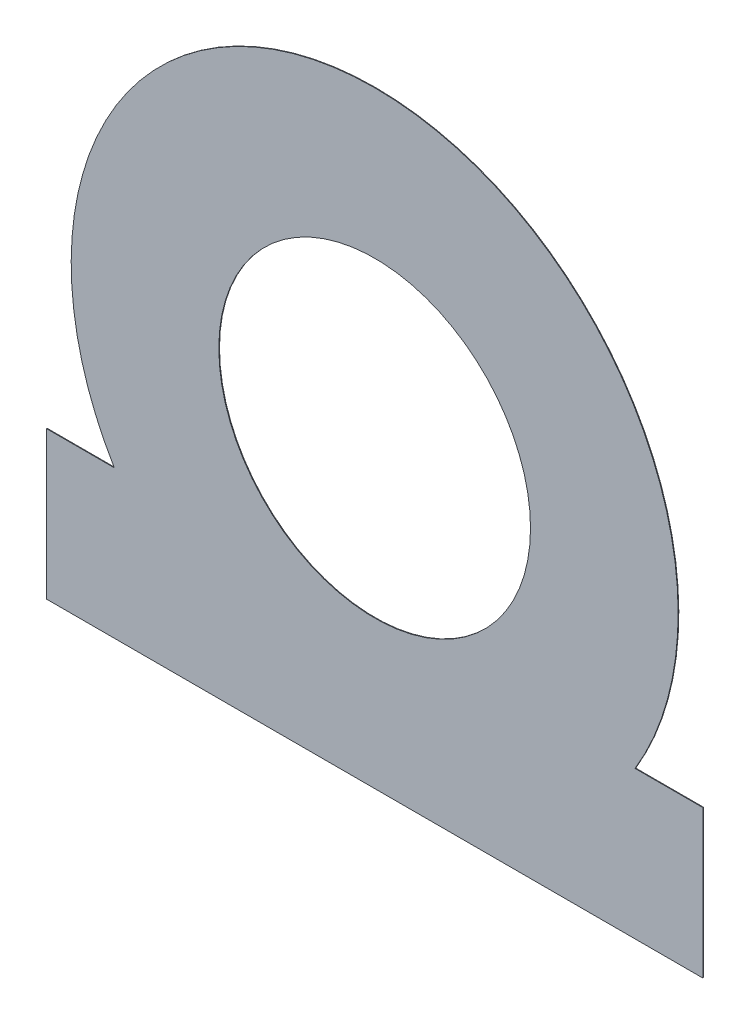
ISO-10303-21;
HEADER;
FILE_DESCRIPTION(('STEP AP214'),'2;1');
FILE_NAME('part.step','',(''),(''),'','','');
FILE_SCHEMA(('AUTOMOTIVE_DESIGN { 1 0 10303 214 1 1 1 1 }'));
ENDSEC;
DATA;
#1=APPLICATION_CONTEXT('core data for automotive mechanical design processes');
#2=APPLICATION_PROTOCOL_DEFINITION('international standard','automotive_design',2000,#1);
#3=PRODUCT_CONTEXT('',#1,'mechanical');
#4=PRODUCT('Part','Part','',(#3));
#5=PRODUCT_RELATED_PRODUCT_CATEGORY('part','',(#4));
#6=PRODUCT_DEFINITION_FORMATION('','',#4);
#7=PRODUCT_DEFINITION_CONTEXT('part definition',#1,'design');
#8=PRODUCT_DEFINITION('design','',#6,#7);
#9=PRODUCT_DEFINITION_SHAPE('','',#8);
#10=(LENGTH_UNIT() NAMED_UNIT(*) SI_UNIT(.MILLI.,.METRE.));
#11=(NAMED_UNIT(*) PLANE_ANGLE_UNIT() SI_UNIT($,.RADIAN.));
#12=(NAMED_UNIT(*) SI_UNIT($,.STERADIAN.) SOLID_ANGLE_UNIT());
#13=UNCERTAINTY_MEASURE_WITH_UNIT(LENGTH_MEASURE(1.E-05),#10,'distance_accuracy_value','');
#14=(GEOMETRIC_REPRESENTATION_CONTEXT(3) GLOBAL_UNCERTAINTY_ASSIGNED_CONTEXT((#13)) GLOBAL_UNIT_ASSIGNED_CONTEXT((#10,
#11,#12)) REPRESENTATION_CONTEXT('',''));
#15=CARTESIAN_POINT('',(0.,0.,0.));
#16=DIRECTION('',(0.,0.,1.));
#17=DIRECTION('',(1.,0.,0.));
#18=AXIS2_PLACEMENT_3D('',#15,#16,#17);
#19=CARTESIAN_POINT('',(0.,0.,2.));
#20=DIRECTION('',(0.,0.,1.));
#21=DIRECTION('',(1.,0.,0.));
#22=AXIS2_PLACEMENT_3D('',#19,#20,#21);
#23=PLANE('',#22);
#24=CARTESIAN_POINT('',(0.,0.,2.));
#25=DIRECTION('',(0.,0.,1.));
#26=DIRECTION('',(1.,0.,0.));
#27=AXIS2_PLACEMENT_3D('',#24,#25,#26);
#28=CIRCLE('',#27,925.);
#29=CARTESIAN_POINT('',(793.725393319377,-475.,2.));
#30=VERTEX_POINT('',#29);
#31=CARTESIAN_POINT('',(-793.725393319377,-475.,2.));
#32=VERTEX_POINT('',#31);
#33=EDGE_CURVE('E135',#30,#32,#28,.T.);
#34=ORIENTED_EDGE('',*,*,#33,.T.);
#35=DIRECTION('',(-1.,0.,0.));
#36=VECTOR('',#35,1.);
#37=CARTESIAN_POINT('',(-793.725393319377,-475.,2.));
#38=LINE('',#37,#36);
#39=CARTESIAN_POINT('',(-1000.,-475.,2.));
#40=VERTEX_POINT('',#39);
#41=EDGE_CURVE('E93',#32,#40,#38,.T.);
#42=ORIENTED_EDGE('',*,*,#41,.T.);
#43=DIRECTION('',(0.,-1.,0.));
#44=VECTOR('',#43,1.);
#45=CARTESIAN_POINT('',(-1000.,-925.,2.));
#46=LINE('',#45,#44);
#47=CARTESIAN_POINT('',(-1000.,-925.,2.));
#48=VERTEX_POINT('',#47);
#49=EDGE_CURVE('E106',#40,#48,#46,.T.);
#50=ORIENTED_EDGE('',*,*,#49,.T.);
#51=DIRECTION('',(1.,0.,0.));
#52=VECTOR('',#51,1.);
#53=CARTESIAN_POINT('',(1000.,-925.,2.));
#54=LINE('',#53,#52);
#55=CARTESIAN_POINT('',(1000.,-925.,2.));
#56=VERTEX_POINT('',#55);
#57=EDGE_CURVE('E100',#48,#56,#54,.T.);
#58=ORIENTED_EDGE('',*,*,#57,.T.);
#59=DIRECTION('',(0.,1.,0.));
#60=VECTOR('',#59,1.);
#61=CARTESIAN_POINT('',(1000.,-925.,2.));
#62=LINE('',#61,#60);
#63=CARTESIAN_POINT('',(1000.,-475.,2.));
#64=VERTEX_POINT('',#63);
#65=EDGE_CURVE('E104',#56,#64,#62,.T.);
#66=ORIENTED_EDGE('',*,*,#65,.T.);
#67=DIRECTION('',(-1.,0.,0.));
#68=VECTOR('',#67,1.);
#69=CARTESIAN_POINT('',(1000.,-475.,2.));
#70=LINE('',#69,#68);
#71=EDGE_CURVE('E56',#64,#30,#70,.T.);
#72=ORIENTED_EDGE('',*,*,#71,.T.);
#73=EDGE_LOOP('',(#34,#42,#50,#58,#66,#72));
#74=FACE_BOUND('',#73,.T.);
#75=CARTESIAN_POINT('',(0.,0.,2.));
#76=DIRECTION('',(0.,0.,1.));
#77=DIRECTION('',(1.,0.,0.));
#78=AXIS2_PLACEMENT_3D('',#75,#76,#77);
#79=CIRCLE('',#78,475.);
#80=CARTESIAN_POINT('',(475.,0.,2.));
#81=VERTEX_POINT('',#80);
#82=EDGE_CURVE('E128',#81,#81,#79,.T.);
#83=ORIENTED_EDGE('',*,*,#82,.F.);
#84=EDGE_LOOP('',(#83));
#85=FACE_BOUND('',#84,.T.);
#86=ADVANCED_FACE('F39',(#74,#85),#23,.T.);
#87=CARTESIAN_POINT('',(0.,0.,0.));
#88=DIRECTION('',(0.,0.,1.));
#89=DIRECTION('',(1.,0.,0.));
#90=AXIS2_PLACEMENT_3D('',#87,#88,#89);
#91=PLANE('',#90);
#92=CARTESIAN_POINT('',(0.,0.,0.));
#93=DIRECTION('',(0.,0.,1.));
#94=DIRECTION('',(1.,0.,0.));
#95=AXIS2_PLACEMENT_3D('',#92,#93,#94);
#96=CIRCLE('',#95,925.);
#97=CARTESIAN_POINT('',(793.725393319377,-475.,0.));
#98=VERTEX_POINT('',#97);
#99=CARTESIAN_POINT('',(-793.725393319377,-475.,0.));
#100=VERTEX_POINT('',#99);
#101=EDGE_CURVE('E124',#98,#100,#96,.T.);
#102=ORIENTED_EDGE('',*,*,#101,.F.);
#103=DIRECTION('',(-1.,0.,0.));
#104=VECTOR('',#103,1.);
#105=CARTESIAN_POINT('',(1000.,-475.,0.));
#106=LINE('',#105,#104);
#107=CARTESIAN_POINT('',(1000.,-475.,0.));
#108=VERTEX_POINT('',#107);
#109=EDGE_CURVE('E85',#108,#98,#106,.T.);
#110=ORIENTED_EDGE('',*,*,#109,.F.);
#111=DIRECTION('',(0.,1.,0.));
#112=VECTOR('',#111,1.);
#113=CARTESIAN_POINT('',(1000.,-925.,0.));
#114=LINE('',#113,#112);
#115=CARTESIAN_POINT('',(1000.,-925.,0.));
#116=VERTEX_POINT('',#115);
#117=EDGE_CURVE('E79',#116,#108,#114,.T.);
#118=ORIENTED_EDGE('',*,*,#117,.F.);
#119=DIRECTION('',(1.,0.,0.));
#120=VECTOR('',#119,1.);
#121=CARTESIAN_POINT('',(1000.,-925.,0.));
#122=LINE('',#121,#120);
#123=CARTESIAN_POINT('',(-1000.,-925.,0.));
#124=VERTEX_POINT('',#123);
#125=EDGE_CURVE('E114',#124,#116,#122,.T.);
#126=ORIENTED_EDGE('',*,*,#125,.F.);
#127=DIRECTION('',(0.,-1.,0.));
#128=VECTOR('',#127,1.);
#129=CARTESIAN_POINT('',(-1000.,-925.,0.));
#130=LINE('',#129,#128);
#131=CARTESIAN_POINT('',(-1000.,-475.,0.));
#132=VERTEX_POINT('',#131);
#133=EDGE_CURVE('E130',#132,#124,#130,.T.);
#134=ORIENTED_EDGE('',*,*,#133,.F.);
#135=DIRECTION('',(-1.,0.,0.));
#136=VECTOR('',#135,1.);
#137=CARTESIAN_POINT('',(-793.725393319377,-475.,0.));
#138=LINE('',#137,#136);
#139=EDGE_CURVE('E127',#100,#132,#138,.T.);
#140=ORIENTED_EDGE('',*,*,#139,.F.);
#141=EDGE_LOOP('',(#102,#110,#118,#126,#134,#140));
#142=FACE_BOUND('',#141,.T.);
#143=CARTESIAN_POINT('',(0.,0.,0.));
#144=DIRECTION('',(0.,0.,1.));
#145=DIRECTION('',(1.,0.,0.));
#146=AXIS2_PLACEMENT_3D('',#143,#144,#145);
#147=CIRCLE('',#146,475.);
#148=CARTESIAN_POINT('',(475.,0.,0.));
#149=VERTEX_POINT('',#148);
#150=EDGE_CURVE('E228',#149,#149,#147,.T.);
#151=ORIENTED_EDGE('',*,*,#150,.T.);
#152=EDGE_LOOP('',(#151));
#153=FACE_BOUND('',#152,.T.);
#154=ADVANCED_FACE('F144',(#142,#153),#91,.F.);
#155=CARTESIAN_POINT('',(0.,0.,2.));
#156=DIRECTION('',(0.,0.,-1.));
#157=DIRECTION('',(-1.,0.,0.));
#158=AXIS2_PLACEMENT_3D('',#155,#156,#157);
#159=CYLINDRICAL_SURFACE('',#158,925.);
#160=ORIENTED_EDGE('',*,*,#101,.T.);
#161=DIRECTION('',(0.,0.,-1.));
#162=VECTOR('',#161,1.);
#163=CARTESIAN_POINT('',(-793.725393319377,-475.,2.));
#164=LINE('',#163,#162);
#165=EDGE_CURVE('E11',#32,#100,#164,.T.);
#166=ORIENTED_EDGE('',*,*,#165,.F.);
#167=ORIENTED_EDGE('',*,*,#33,.F.);
#168=DIRECTION('',(0.,0.,-1.));
#169=VECTOR('',#168,1.);
#170=CARTESIAN_POINT('',(793.725393319377,-475.,2.));
#171=LINE('',#170,#169);
#172=EDGE_CURVE('E120',#30,#98,#171,.T.);
#173=ORIENTED_EDGE('',*,*,#172,.T.);
#174=EDGE_LOOP('',(#160,#166,#167,#173));
#175=FACE_BOUND('',#174,.T.);
#176=ADVANCED_FACE('F41',(#175),#159,.T.);
#177=CARTESIAN_POINT('',(-793.725393319377,-475.,2.));
#178=DIRECTION('',(0.,-1.,0.));
#179=DIRECTION('',(0.,0.,-1.));
#180=AXIS2_PLACEMENT_3D('',#177,#178,#179);
#181=PLANE('',#180);
#182=ORIENTED_EDGE('',*,*,#139,.T.);
#183=DIRECTION('',(0.,0.,-1.));
#184=VECTOR('',#183,1.);
#185=CARTESIAN_POINT('',(-1000.,-475.,2.));
#186=LINE('',#185,#184);
#187=EDGE_CURVE('E48',#40,#132,#186,.T.);
#188=ORIENTED_EDGE('',*,*,#187,.F.);
#189=ORIENTED_EDGE('',*,*,#41,.F.);
#190=ORIENTED_EDGE('',*,*,#165,.T.);
#191=EDGE_LOOP('',(#182,#188,#189,#190));
#192=FACE_BOUND('',#191,.T.);
#193=ADVANCED_FACE('F169',(#192),#181,.F.);
#194=CARTESIAN_POINT('',(-1000.,-925.,2.));
#195=DIRECTION('',(1.,0.,0.));
#196=DIRECTION('',(0.,0.,-1.));
#197=AXIS2_PLACEMENT_3D('',#194,#195,#196);
#198=PLANE('',#197);
#199=ORIENTED_EDGE('',*,*,#133,.T.);
#200=DIRECTION('',(0.,0.,-1.));
#201=VECTOR('',#200,1.);
#202=CARTESIAN_POINT('',(-1000.,-925.,2.));
#203=LINE('',#202,#201);
#204=EDGE_CURVE('E115',#48,#124,#203,.T.);
#205=ORIENTED_EDGE('',*,*,#204,.F.);
#206=ORIENTED_EDGE('',*,*,#49,.F.);
#207=ORIENTED_EDGE('',*,*,#187,.T.);
#208=EDGE_LOOP('',(#199,#205,#206,#207));
#209=FACE_BOUND('',#208,.T.);
#210=ADVANCED_FACE('F141',(#209),#198,.F.);
#211=CARTESIAN_POINT('',(1000.,-925.,2.));
#212=DIRECTION('',(0.,1.,0.));
#213=DIRECTION('',(-1.,0.,0.));
#214=AXIS2_PLACEMENT_3D('',#211,#212,#213);
#215=PLANE('',#214);
#216=ORIENTED_EDGE('',*,*,#125,.T.);
#217=DIRECTION('',(0.,0.,-1.));
#218=VECTOR('',#217,1.);
#219=CARTESIAN_POINT('',(1000.,-925.,2.));
#220=LINE('',#219,#218);
#221=EDGE_CURVE('E111',#56,#116,#220,.T.);
#222=ORIENTED_EDGE('',*,*,#221,.F.);
#223=ORIENTED_EDGE('',*,*,#57,.F.);
#224=ORIENTED_EDGE('',*,*,#204,.T.);
#225=EDGE_LOOP('',(#216,#222,#223,#224));
#226=FACE_BOUND('',#225,.T.);
#227=ADVANCED_FACE('F112',(#226),#215,.F.);
#228=CARTESIAN_POINT('',(1000.,-925.,2.));
#229=DIRECTION('',(-1.,0.,0.));
#230=DIRECTION('',(0.,0.,1.));
#231=AXIS2_PLACEMENT_3D('',#228,#229,#230);
#232=PLANE('',#231);
#233=ORIENTED_EDGE('',*,*,#117,.T.);
#234=DIRECTION('',(0.,0.,-1.));
#235=VECTOR('',#234,1.);
#236=CARTESIAN_POINT('',(1000.,-475.,2.));
#237=LINE('',#236,#235);
#238=EDGE_CURVE('E116',#64,#108,#237,.T.);
#239=ORIENTED_EDGE('',*,*,#238,.F.);
#240=ORIENTED_EDGE('',*,*,#65,.F.);
#241=ORIENTED_EDGE('',*,*,#221,.T.);
#242=EDGE_LOOP('',(#233,#239,#240,#241));
#243=FACE_BOUND('',#242,.T.);
#244=ADVANCED_FACE('F118',(#243),#232,.F.);
#245=CARTESIAN_POINT('',(1000.,-475.,2.));
#246=DIRECTION('',(0.,-1.,0.));
#247=DIRECTION('',(1.,0.,0.));
#248=AXIS2_PLACEMENT_3D('',#245,#246,#247);
#249=PLANE('',#248);
#250=ORIENTED_EDGE('',*,*,#109,.T.);
#251=ORIENTED_EDGE('',*,*,#172,.F.);
#252=ORIENTED_EDGE('',*,*,#71,.F.);
#253=ORIENTED_EDGE('',*,*,#238,.T.);
#254=EDGE_LOOP('',(#250,#251,#252,#253));
#255=FACE_BOUND('',#254,.T.);
#256=ADVANCED_FACE('F149',(#255),#249,.F.);
#257=CARTESIAN_POINT('',(0.,0.,2.));
#258=DIRECTION('',(0.,0.,-1.));
#259=DIRECTION('',(-1.,0.,0.));
#260=AXIS2_PLACEMENT_3D('',#257,#258,#259);
#261=CYLINDRICAL_SURFACE('',#260,475.);
#262=ORIENTED_EDGE('',*,*,#82,.T.);
#263=EDGE_LOOP('',(#262));
#264=FACE_BOUND('',#263,.T.);
#265=ORIENTED_EDGE('',*,*,#150,.F.);
#266=EDGE_LOOP('',(#265));
#267=FACE_BOUND('',#266,.T.);
#268=ADVANCED_FACE('F151',(#264,#267),#261,.F.);
#269=CLOSED_SHELL('',(#86,#154,#176,#193,#210,#227,#244,#256,#268));
#270=MANIFOLD_SOLID_BREP('B2',#269);
#271=ADVANCED_BREP_SHAPE_REPRESENTATION('',(#18,#270),#14);
#272=SHAPE_DEFINITION_REPRESENTATION(#9,#271);
ENDSEC;
END-ISO-10303-21;
